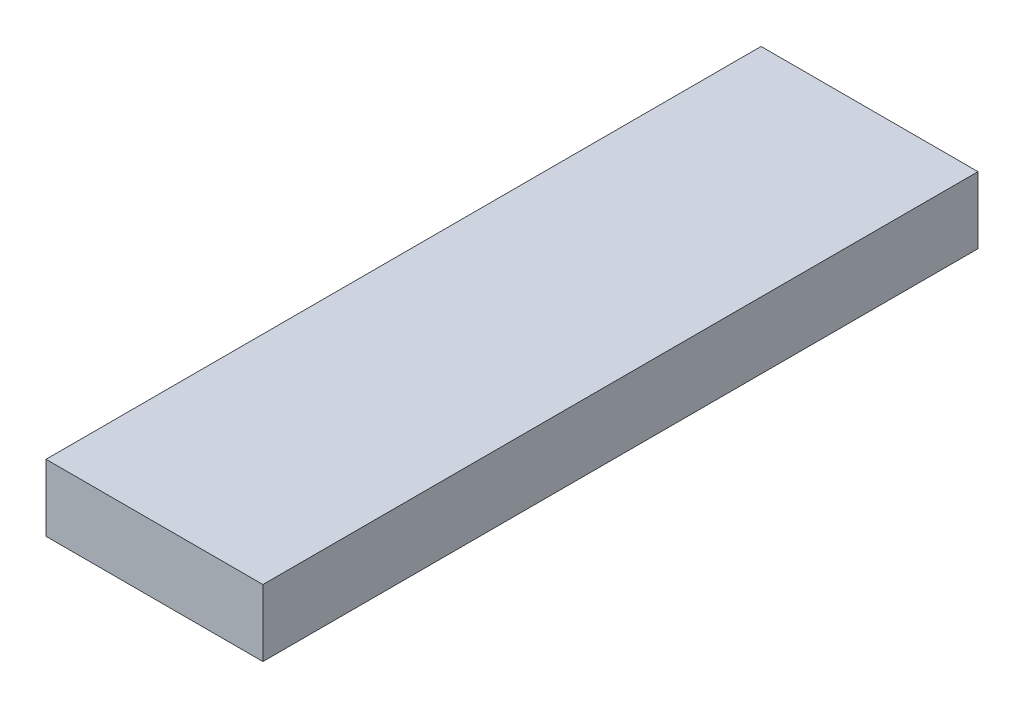
ISO-10303-21;
HEADER;
FILE_DESCRIPTION(('STEP AP214'),'2;1');
FILE_NAME('part.step','',(''),(''),'','','');
FILE_SCHEMA(('AUTOMOTIVE_DESIGN { 1 0 10303 214 1 1 1 1 }'));
ENDSEC;
DATA;
#1=APPLICATION_CONTEXT('core data for automotive mechanical design processes');
#2=APPLICATION_PROTOCOL_DEFINITION('international standard','automotive_design',2000,#1);
#3=PRODUCT_CONTEXT('',#1,'mechanical');
#4=PRODUCT('Part','Part','',(#3));
#5=PRODUCT_RELATED_PRODUCT_CATEGORY('part','',(#4));
#6=PRODUCT_DEFINITION_FORMATION('','',#4);
#7=PRODUCT_DEFINITION_CONTEXT('part definition',#1,'design');
#8=PRODUCT_DEFINITION('design','',#6,#7);
#9=PRODUCT_DEFINITION_SHAPE('','',#8);
#10=(LENGTH_UNIT() NAMED_UNIT(*) SI_UNIT(.MILLI.,.METRE.));
#11=(NAMED_UNIT(*) PLANE_ANGLE_UNIT() SI_UNIT($,.RADIAN.));
#12=(NAMED_UNIT(*) SI_UNIT($,.STERADIAN.) SOLID_ANGLE_UNIT());
#13=UNCERTAINTY_MEASURE_WITH_UNIT(LENGTH_MEASURE(1.E-05),#10,'distance_accuracy_value','');
#14=(GEOMETRIC_REPRESENTATION_CONTEXT(3) GLOBAL_UNCERTAINTY_ASSIGNED_CONTEXT((#13)) GLOBAL_UNIT_ASSIGNED_CONTEXT((#10,
#11,#12)) REPRESENTATION_CONTEXT('',''));
#15=CARTESIAN_POINT('',(0.,0.,0.));
#16=DIRECTION('',(0.,0.,1.));
#17=DIRECTION('',(1.,0.,0.));
#18=AXIS2_PLACEMENT_3D('',#15,#16,#17);
#19=CARTESIAN_POINT('',(-11.557,7.112,-38.1));
#20=DIRECTION('',(1.,0.,0.));
#21=DIRECTION('',(0.,0.,-1.));
#22=AXIS2_PLACEMENT_3D('',#19,#20,#21);
#23=PLANE('',#22);
#24=DIRECTION('',(0.,0.,1.));
#25=VECTOR('',#24,1.);
#26=CARTESIAN_POINT('',(-11.557,0.,-38.1));
#27=LINE('',#26,#25);
#28=CARTESIAN_POINT('',(-11.557,0.,-38.1));
#29=VERTEX_POINT('',#28);
#30=CARTESIAN_POINT('',(-11.557,0.,38.1));
#31=VERTEX_POINT('',#30);
#32=EDGE_CURVE('E101',#29,#31,#27,.T.);
#33=ORIENTED_EDGE('',*,*,#32,.T.);
#34=DIRECTION('',(0.,-1.,0.));
#35=VECTOR('',#34,1.);
#36=CARTESIAN_POINT('',(-11.557,7.112,38.1));
#37=LINE('',#36,#35);
#38=CARTESIAN_POINT('',(-11.557,7.112,38.1));
#39=VERTEX_POINT('',#38);
#40=EDGE_CURVE('E11',#39,#31,#37,.T.);
#41=ORIENTED_EDGE('',*,*,#40,.F.);
#42=DIRECTION('',(0.,0.,1.));
#43=VECTOR('',#42,1.);
#44=CARTESIAN_POINT('',(-11.557,7.112,-38.1));
#45=LINE('',#44,#43);
#46=CARTESIAN_POINT('',(-11.557,7.112,-38.1));
#47=VERTEX_POINT('',#46);
#48=EDGE_CURVE('E89',#47,#39,#45,.T.);
#49=ORIENTED_EDGE('',*,*,#48,.F.);
#50=DIRECTION('',(0.,-1.,0.));
#51=VECTOR('',#50,1.);
#52=CARTESIAN_POINT('',(-11.557,7.112,-38.1));
#53=LINE('',#52,#51);
#54=EDGE_CURVE('E97',#47,#29,#53,.T.);
#55=ORIENTED_EDGE('',*,*,#54,.T.);
#56=EDGE_LOOP('',(#33,#41,#49,#55));
#57=FACE_BOUND('',#56,.T.);
#58=ADVANCED_FACE('F38',(#57),#23,.F.);
#59=CARTESIAN_POINT('',(11.557,7.112,38.1));
#60=DIRECTION('',(0.,0.,-1.));
#61=DIRECTION('',(-1.,0.,0.));
#62=AXIS2_PLACEMENT_3D('',#59,#60,#61);
#63=PLANE('',#62);
#64=DIRECTION('',(1.,0.,0.));
#65=VECTOR('',#64,1.);
#66=CARTESIAN_POINT('',(11.557,0.,38.1));
#67=LINE('',#66,#65);
#68=CARTESIAN_POINT('',(11.557,0.,38.1));
#69=VERTEX_POINT('',#68);
#70=EDGE_CURVE('E93',#31,#69,#67,.T.);
#71=ORIENTED_EDGE('',*,*,#70,.T.);
#72=DIRECTION('',(0.,-1.,0.));
#73=VECTOR('',#72,1.);
#74=CARTESIAN_POINT('',(11.557,7.112,38.1));
#75=LINE('',#74,#73);
#76=CARTESIAN_POINT('',(11.557,7.112,38.1));
#77=VERTEX_POINT('',#76);
#78=EDGE_CURVE('E46',#77,#69,#75,.T.);
#79=ORIENTED_EDGE('',*,*,#78,.F.);
#80=DIRECTION('',(1.,0.,0.));
#81=VECTOR('',#80,1.);
#82=CARTESIAN_POINT('',(11.557,7.112,38.1));
#83=LINE('',#82,#81);
#84=EDGE_CURVE('E84',#39,#77,#83,.T.);
#85=ORIENTED_EDGE('',*,*,#84,.F.);
#86=ORIENTED_EDGE('',*,*,#40,.T.);
#87=EDGE_LOOP('',(#71,#79,#85,#86));
#88=FACE_BOUND('',#87,.T.);
#89=ADVANCED_FACE('F92',(#88),#63,.F.);
#90=CARTESIAN_POINT('',(11.557,7.112,-38.1));
#91=DIRECTION('',(-1.,0.,0.));
#92=DIRECTION('',(0.,0.,1.));
#93=AXIS2_PLACEMENT_3D('',#90,#91,#92);
#94=PLANE('',#93);
#95=DIRECTION('',(0.,0.,-1.));
#96=VECTOR('',#95,1.);
#97=CARTESIAN_POINT('',(11.557,0.,-38.1));
#98=LINE('',#97,#96);
#99=CARTESIAN_POINT('',(11.557,0.,-38.1));
#100=VERTEX_POINT('',#99);
#101=EDGE_CURVE('E71',#69,#100,#98,.T.);
#102=ORIENTED_EDGE('',*,*,#101,.T.);
#103=DIRECTION('',(0.,-1.,0.));
#104=VECTOR('',#103,1.);
#105=CARTESIAN_POINT('',(11.557,7.112,-38.1));
#106=LINE('',#105,#104);
#107=CARTESIAN_POINT('',(11.557,7.112,-38.1));
#108=VERTEX_POINT('',#107);
#109=EDGE_CURVE('E94',#108,#100,#106,.T.);
#110=ORIENTED_EDGE('',*,*,#109,.F.);
#111=DIRECTION('',(0.,0.,-1.));
#112=VECTOR('',#111,1.);
#113=CARTESIAN_POINT('',(11.557,7.112,-38.1));
#114=LINE('',#113,#112);
#115=EDGE_CURVE('E87',#77,#108,#114,.T.);
#116=ORIENTED_EDGE('',*,*,#115,.F.);
#117=ORIENTED_EDGE('',*,*,#78,.T.);
#118=EDGE_LOOP('',(#102,#110,#116,#117));
#119=FACE_BOUND('',#118,.T.);
#120=ADVANCED_FACE('F95',(#119),#94,.F.);
#121=CARTESIAN_POINT('',(11.557,7.112,-38.1));
#122=DIRECTION('',(0.,0.,1.));
#123=DIRECTION('',(1.,0.,0.));
#124=AXIS2_PLACEMENT_3D('',#121,#122,#123);
#125=PLANE('',#124);
#126=DIRECTION('',(-1.,0.,0.));
#127=VECTOR('',#126,1.);
#128=CARTESIAN_POINT('',(11.557,0.,-38.1));
#129=LINE('',#128,#127);
#130=EDGE_CURVE('E77',#100,#29,#129,.T.);
#131=ORIENTED_EDGE('',*,*,#130,.T.);
#132=ORIENTED_EDGE('',*,*,#54,.F.);
#133=DIRECTION('',(-1.,0.,0.));
#134=VECTOR('',#133,1.);
#135=CARTESIAN_POINT('',(11.557,7.112,-38.1));
#136=LINE('',#135,#134);
#137=EDGE_CURVE('E54',#108,#47,#136,.T.);
#138=ORIENTED_EDGE('',*,*,#137,.F.);
#139=ORIENTED_EDGE('',*,*,#109,.T.);
#140=EDGE_LOOP('',(#131,#132,#138,#139));
#141=FACE_BOUND('',#140,.T.);
#142=ADVANCED_FACE('F108',(#141),#125,.F.);
#143=CARTESIAN_POINT('',(-11.557,7.112,38.1));
#144=DIRECTION('',(0.,-1.,0.));
#145=DIRECTION('',(0.,0.,-1.));
#146=AXIS2_PLACEMENT_3D('',#143,#144,#145);
#147=PLANE('',#146);
#148=ORIENTED_EDGE('',*,*,#48,.T.);
#149=ORIENTED_EDGE('',*,*,#84,.T.);
#150=ORIENTED_EDGE('',*,*,#115,.T.);
#151=ORIENTED_EDGE('',*,*,#137,.T.);
#152=EDGE_LOOP('',(#148,#149,#150,#151));
#153=FACE_BOUND('',#152,.T.);
#154=ADVANCED_FACE('F85',(#153),#147,.F.);
#155=CARTESIAN_POINT('',(-11.557,0.,38.1));
#156=DIRECTION('',(0.,-1.,0.));
#157=DIRECTION('',(0.,0.,-1.));
#158=AXIS2_PLACEMENT_3D('',#155,#156,#157);
#159=PLANE('',#158);
#160=ORIENTED_EDGE('',*,*,#32,.F.);
#161=ORIENTED_EDGE('',*,*,#130,.F.);
#162=ORIENTED_EDGE('',*,*,#101,.F.);
#163=ORIENTED_EDGE('',*,*,#70,.F.);
#164=EDGE_LOOP('',(#160,#161,#162,#163));
#165=FACE_BOUND('',#164,.T.);
#166=ADVANCED_FACE('F111',(#165),#159,.T.);
#167=CLOSED_SHELL('',(#58,#89,#120,#142,#154,#166));
#168=MANIFOLD_SOLID_BREP('B2',#167);
#169=ADVANCED_BREP_SHAPE_REPRESENTATION('',(#18,#168),#14);
#170=SHAPE_DEFINITION_REPRESENTATION(#9,#169);
ENDSEC;
END-ISO-10303-21;
